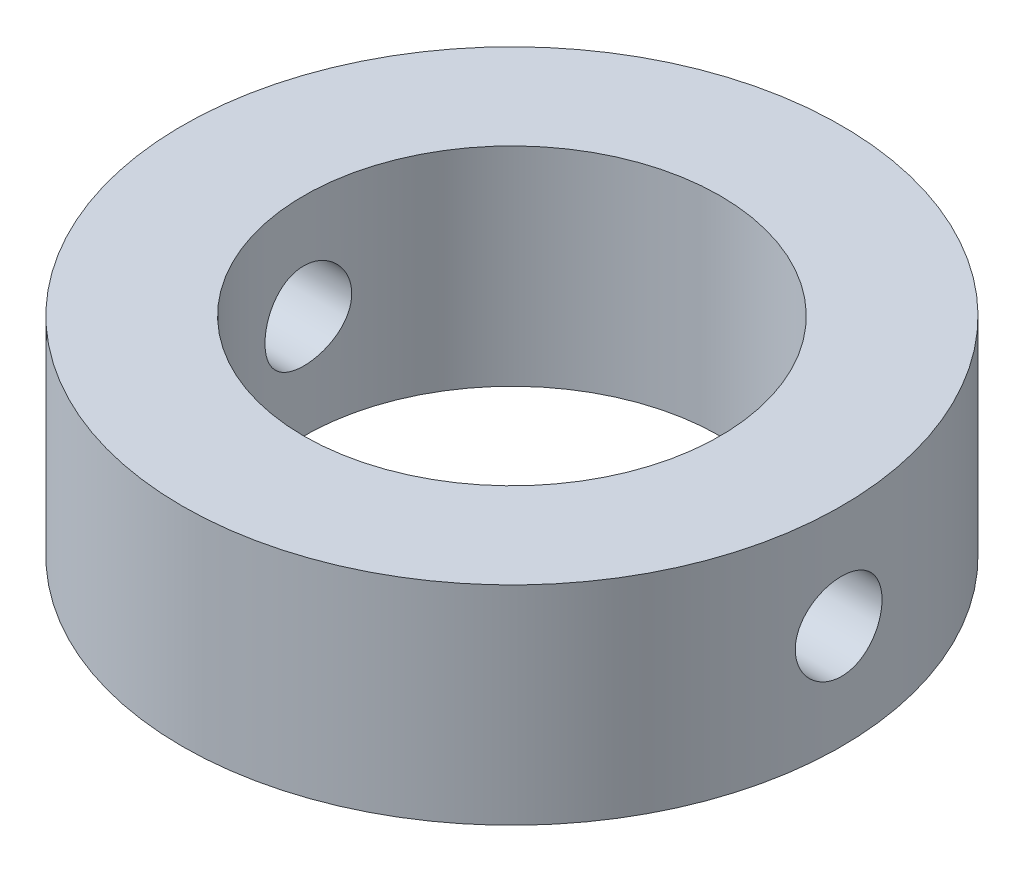
ISO-10303-21;
HEADER;
FILE_DESCRIPTION(('STEP AP214'),'2;1');
FILE_NAME('part.step','',(''),(''),'','','');
FILE_SCHEMA(('AUTOMOTIVE_DESIGN { 1 0 10303 214 1 1 1 1 }'));
ENDSEC;
DATA;
#1=APPLICATION_CONTEXT('core data for automotive mechanical design processes');
#2=APPLICATION_PROTOCOL_DEFINITION('international standard','automotive_design',2000,#1);
#3=PRODUCT_CONTEXT('',#1,'mechanical');
#4=PRODUCT('Part','Part','',(#3));
#5=PRODUCT_RELATED_PRODUCT_CATEGORY('part','',(#4));
#6=PRODUCT_DEFINITION_FORMATION('','',#4);
#7=PRODUCT_DEFINITION_CONTEXT('part definition',#1,'design');
#8=PRODUCT_DEFINITION('design','',#6,#7);
#9=PRODUCT_DEFINITION_SHAPE('','',#8);
#10=(LENGTH_UNIT() NAMED_UNIT(*) SI_UNIT(.MILLI.,.METRE.));
#11=(NAMED_UNIT(*) PLANE_ANGLE_UNIT() SI_UNIT($,.RADIAN.));
#12=(NAMED_UNIT(*) SI_UNIT($,.STERADIAN.) SOLID_ANGLE_UNIT());
#13=UNCERTAINTY_MEASURE_WITH_UNIT(LENGTH_MEASURE(1.E-05),#10,'distance_accuracy_value','');
#14=(GEOMETRIC_REPRESENTATION_CONTEXT(3) GLOBAL_UNCERTAINTY_ASSIGNED_CONTEXT((#13)) GLOBAL_UNIT_ASSIGNED_CONTEXT((#10,
#11,#12)) REPRESENTATION_CONTEXT('',''));
#15=CARTESIAN_POINT('',(0.,0.,0.));
#16=DIRECTION('',(0.,0.,1.));
#17=DIRECTION('',(1.,0.,0.));
#18=AXIS2_PLACEMENT_3D('',#15,#16,#17);
#19=CARTESIAN_POINT('',(0.,11.9999999999999,0.));
#20=DIRECTION('',(0.,1.,0.));
#21=DIRECTION('',(0.,0.,1.));
#22=AXIS2_PLACEMENT_3D('',#19,#20,#21);
#23=PLANE('',#22);
#24=CARTESIAN_POINT('',(0.,11.9999999999999,0.));
#25=DIRECTION('',(0.,1.,0.));
#26=DIRECTION('',(0.,0.,1.));
#27=AXIS2_PLACEMENT_3D('',#24,#25,#26);
#28=CIRCLE('',#27,19.);
#29=CARTESIAN_POINT('',(0.,11.9999999999999,19.));
#30=VERTEX_POINT('',#29);
#31=EDGE_CURVE('E12',#30,#30,#28,.T.);
#32=ORIENTED_EDGE('',*,*,#31,.T.);
#33=EDGE_LOOP('',(#32));
#34=FACE_BOUND('',#33,.T.);
#35=CARTESIAN_POINT('',(0.,11.9999999999999,0.));
#36=DIRECTION('',(0.,1.,0.));
#37=DIRECTION('',(0.,0.,1.));
#38=AXIS2_PLACEMENT_3D('',#35,#36,#37);
#39=CIRCLE('',#38,12.);
#40=CARTESIAN_POINT('',(0.,11.9999999999999,12.));
#41=VERTEX_POINT('',#40);
#42=EDGE_CURVE('E72',#41,#41,#39,.T.);
#43=ORIENTED_EDGE('',*,*,#42,.F.);
#44=EDGE_LOOP('',(#43));
#45=FACE_BOUND('',#44,.T.);
#46=ADVANCED_FACE('F50',(#34,#45),#23,.T.);
#47=CARTESIAN_POINT('',(0.,0.,0.));
#48=DIRECTION('',(0.,1.,0.));
#49=DIRECTION('',(0.,0.,1.));
#50=AXIS2_PLACEMENT_3D('',#47,#48,#49);
#51=PLANE('',#50);
#52=CARTESIAN_POINT('',(0.,0.,0.));
#53=DIRECTION('',(0.,1.,0.));
#54=DIRECTION('',(0.,0.,1.));
#55=AXIS2_PLACEMENT_3D('',#52,#53,#54);
#56=CIRCLE('',#55,19.);
#57=CARTESIAN_POINT('',(0.,0.,19.));
#58=VERTEX_POINT('',#57);
#59=EDGE_CURVE('E65',#58,#58,#56,.T.);
#60=ORIENTED_EDGE('',*,*,#59,.F.);
#61=EDGE_LOOP('',(#60));
#62=FACE_BOUND('',#61,.T.);
#63=CARTESIAN_POINT('',(0.,0.,0.));
#64=DIRECTION('',(0.,1.,0.));
#65=DIRECTION('',(0.,0.,1.));
#66=AXIS2_PLACEMENT_3D('',#63,#64,#65);
#67=CIRCLE('',#66,12.);
#68=CARTESIAN_POINT('',(0.,0.,12.));
#69=VERTEX_POINT('',#68);
#70=EDGE_CURVE('E75',#69,#69,#67,.T.);
#71=ORIENTED_EDGE('',*,*,#70,.T.);
#72=EDGE_LOOP('',(#71));
#73=FACE_BOUND('',#72,.T.);
#74=ADVANCED_FACE('F118',(#62,#73),#51,.F.);
#75=CARTESIAN_POINT('',(0.,11.9999999999999,0.));
#76=DIRECTION('',(0.,-1.,0.));
#77=DIRECTION('',(0.,0.,-1.));
#78=AXIS2_PLACEMENT_3D('',#75,#76,#77);
#79=CYLINDRICAL_SURFACE('',#78,19.);
#80=CARTESIAN_POINT('',(-19.,3.50000000000017,0.));
#81=CARTESIAN_POINT('',(-18.999997967774,3.5000058990541,-0.139778315489342));
#82=CARTESIAN_POINT('',(-18.9984412683558,3.51176232524163,-0.279642447495395));
#83=CARTESIAN_POINT('',(-18.9923810422329,3.55847299596374,-0.555474474016736));
#84=CARTESIAN_POINT('',(-18.9878744896332,3.59345106127454,-0.691438217949581));
#85=CARTESIAN_POINT('',(-18.9764219373405,3.68555294093905,-0.955436642925225));
#86=CARTESIAN_POINT('',(-18.9694776299244,3.74266139534077,-1.0834767521693));
#87=CARTESIAN_POINT('',(-18.9539206812216,3.87736834545596,-1.3281327783285));
#88=CARTESIAN_POINT('',(-18.9453083126858,3.9549634920643,-1.44475055826474));
#89=CARTESIAN_POINT('',(-18.9273173646443,4.12894461887619,-1.66398308687906));
#90=CARTESIAN_POINT('',(-18.9179348817317,4.22543026047303,-1.76651843289975));
#91=CARTESIAN_POINT('',(-18.8994924119599,4.43423935267,-1.9539913314688));
#92=CARTESIAN_POINT('',(-18.890432442053,4.54656363425645,-2.03892796010927));
#93=CARTESIAN_POINT('',(-18.8736225658863,4.78438210150586,-2.18909162338545));
#94=CARTESIAN_POINT('',(-18.8658776941046,4.90992404405353,-2.25424363629096));
#95=CARTESIAN_POINT('',(-18.8526269269547,5.17028669033124,-2.362509462566));
#96=CARTESIAN_POINT('',(-18.8471209376663,5.30510700455943,-2.40562420041083));
#97=CARTESIAN_POINT('',(-18.8390089488849,5.57937222882252,-2.46834893112867));
#98=CARTESIAN_POINT('',(-18.8363863510935,5.7187858602936,-2.488093505723));
#99=CARTESIAN_POINT('',(-18.8342874081066,5.99897057854637,-2.50393399543621));
#100=CARTESIAN_POINT('',(-18.8348109231579,6.13974160475402,-2.50003096100303));
#101=CARTESIAN_POINT('',(-18.8389298660036,6.41770409794457,-2.46879737750755));
#102=CARTESIAN_POINT('',(-18.8425058020086,6.55491259793688,-2.44161547626707));
#103=CARTESIAN_POINT('',(-18.852296258763,6.8228037627535,-2.36482786882146));
#104=CARTESIAN_POINT('',(-18.8585108382319,6.95348628227829,-2.3152216635911));
#105=CARTESIAN_POINT('',(-18.8729003199956,7.20507533515605,-2.19483509097748));
#106=CARTESIAN_POINT('',(-18.8810811502029,7.32595079901067,-2.12399053069554));
#107=CARTESIAN_POINT('',(-18.8984768576706,7.55415393130091,-1.96318413435716));
#108=CARTESIAN_POINT('',(-18.9076917872935,7.66148091311375,-1.87322133002779));
#109=CARTESIAN_POINT('',(-18.9262039286229,7.86040295092153,-1.67591027855665));
#110=CARTESIAN_POINT('',(-18.9355012293485,7.9518710348813,-1.56843398279009));
#111=CARTESIAN_POINT('',(-18.9530645440151,8.11548884034062,-1.33958658891131));
#112=CARTESIAN_POINT('',(-18.9613305551191,8.18763850869801,-1.21821545257769));
#113=CARTESIAN_POINT('',(-18.9759058695861,8.31057308687675,-0.964922757293793));
#114=CARTESIAN_POINT('',(-18.9822144030351,8.36134959301136,-0.832997072631032));
#115=CARTESIAN_POINT('',(-18.9921571388022,8.43999334343779,-0.562390331231878));
#116=CARTESIAN_POINT('',(-18.9957914799384,8.46786177690386,-0.423709625549321));
#117=CARTESIAN_POINT('',(-18.9999582136113,8.49973268466778,-0.144626841595007));
#118=CARTESIAN_POINT('',(-19.0005133278906,8.50390998199248,-0.0042450539789587));
#119=CARTESIAN_POINT('',(-18.9985205333266,8.48874205734641,0.275216665266651));
#120=CARTESIAN_POINT('',(-18.9959726978817,8.46939739177325,0.414296627611674));
#121=CARTESIAN_POINT('',(-18.9880744020358,8.4078799409678,0.686687509150033));
#122=CARTESIAN_POINT('',(-18.9827342327916,8.36579096106234,0.820017679004546));
#123=CARTESIAN_POINT('',(-18.9698488481686,8.26006706877678,1.0777276906161));
#124=CARTESIAN_POINT('',(-18.9623035506347,8.19643135362998,1.20210719868896));
#125=CARTESIAN_POINT('',(-18.9457917882835,8.04900056518352,1.43916303555315));
#126=CARTESIAN_POINT('',(-18.9368174879557,7.96509294211371,1.55176881159969));
#127=CARTESIAN_POINT('',(-18.9184749473973,7.77965876593373,1.76136182953444));
#128=CARTESIAN_POINT('',(-18.9091066897838,7.67813143474603,1.8583483813207));
#129=CARTESIAN_POINT('',(-18.8909615049602,7.45956767417587,2.03457405133132));
#130=CARTESIAN_POINT('',(-18.882188695812,7.3424371490131,2.11369695379337));
#131=CARTESIAN_POINT('',(-18.8662967388838,7.09644632354998,2.25114524350553));
#132=CARTESIAN_POINT('',(-18.8591775549807,6.96758627956332,2.30947108507656));
#133=CARTESIAN_POINT('',(-18.8474274353122,6.70216224479831,2.40348340588751));
#134=CARTESIAN_POINT('',(-18.8427894223098,6.5656214071415,2.43923433050317));
#135=CARTESIAN_POINT('',(-18.8365068588229,6.28840915443809,2.48728896692718));
#136=CARTESIAN_POINT('',(-18.834862152745,6.14773795447582,2.49959389747034));
#137=CARTESIAN_POINT('',(-18.8347572836292,5.86741478209673,2.5003832571314));
#138=CARTESIAN_POINT('',(-18.8362727080524,5.72776329805704,2.48905029281038));
#139=CARTESIAN_POINT('',(-18.8422647251658,5.4523689854998,2.44327339157397));
#140=CARTESIAN_POINT('',(-18.8467413170668,5.31662615594053,2.40882946081803));
#141=CARTESIAN_POINT('',(-18.8581434764999,5.05293301890442,2.31786734754341));
#142=CARTESIAN_POINT('',(-18.8650679582855,4.92497928606827,2.26135895042263));
#143=CARTESIAN_POINT('',(-18.8805873470397,4.68034027576126,2.12788991460025));
#144=CARTESIAN_POINT('',(-18.8891822838294,4.56365519951513,2.05092891076786));
#145=CARTESIAN_POINT('',(-18.9071536004537,4.34393356557024,1.87806508524074));
#146=CARTESIAN_POINT('',(-18.916535291463,4.24100437672455,1.78202633147284));
#147=CARTESIAN_POINT('',(-18.9349767535594,4.05265455625561,1.57401834864));
#148=CARTESIAN_POINT('',(-18.9440364485309,3.9672380419353,1.46204538383399));
#149=CARTESIAN_POINT('',(-18.9608556769231,3.81602776093198,1.22480279057951));
#150=CARTESIAN_POINT('',(-18.9686095798624,3.75031806417573,1.09947920166897));
#151=CARTESIAN_POINT('',(-18.9818871351467,3.64097269894889,0.839540973043685));
#152=CARTESIAN_POINT('',(-18.9874131818538,3.59731331933187,0.704936491101737));
#153=CARTESIAN_POINT('',(-18.9942975150946,3.54362547377539,0.474714442967861));
#154=CARTESIAN_POINT('',(-18.9964253917168,3.52728979302763,0.380541684686516));
#155=CARTESIAN_POINT('',(-18.9992773223142,3.50547508744208,0.190925958585074));
#156=CARTESIAN_POINT('',(-19.0000013882199,3.4999959703381,0.0954830015668991));
#157=CARTESIAN_POINT('',(-19.,3.50000000000017,0.));
#158=B_SPLINE_CURVE_WITH_KNOTS('',3,(#80,#81,#82,#83,#84,#85,#86,#87,#88,#89,#90,#91,#92,#93,
#94,#95,#96,#97,#98,#99,#100,#101,#102,#103,#104,#105,#106,#107,#108,#109,#110,#111,#112,#113,
#114,#115,#116,#117,#118,#119,#120,#121,#122,#123,#124,#125,#126,#127,#128,#129,#130,#131,#132,
#133,#134,#135,#136,#137,#138,#139,#140,#141,#142,#143,#144,#145,#146,#147,#148,#149,#150,#151,
#152,#153,#154,#155,#156,#157),.UNSPECIFIED.,.T.,.F.,(4,2,2,2,2,2,2,2,2,2,2,2,2,2,2,2,2,2,2,2,2,
2,2,2,2,2,2,2,2,2,2,2,2,2,2,2,2,2,4),(0.,0.418986144750723,0.838402751295027,1.25752877489169,
1.67658632335897,2.09791737096995,2.51927053226657,2.9422020352143,3.36511579450623,
3.78558208482054,4.20602969778296,4.62381238038419,5.04160436068177,5.46067207111284,
5.87976101093419,6.30206422391832,6.72436859858552,7.1468388638243,7.56928719694783,
7.98861407741509,8.40793103915519,8.82571338706289,9.24351130200046,9.66368440831753,
10.0838760739928,10.5067272952288,10.9295692785286,11.3511986374783,11.7728060793192,
12.1911686022118,12.6095310136043,13.0277080952791,13.4458926429743,13.8671712161902,
14.2885487204712,14.7116990687393,15.1343934209874,15.4206065905888,15.7068173277526),.UNSPECIFIED.);
#159=CARTESIAN_POINT('',(-19.,3.50000000000017,0.));
#160=VERTEX_POINT('',#159);
#161=EDGE_CURVE('E102',#160,#160,#158,.T.);
#162=ORIENTED_EDGE('',*,*,#161,.T.);
#163=EDGE_LOOP('',(#162));
#164=FACE_BOUND('',#163,.T.);
#165=CARTESIAN_POINT('',(18.8348082018373,6.00000000000001,-2.49999999999997));
#166=CARTESIAN_POINT('',(18.8348103005536,5.86022758929279,-2.49999409578521));
#167=CARTESIAN_POINT('',(18.8363808783556,5.72036934508234,-2.48823862932081));
#168=CARTESIAN_POINT('',(18.8424906592257,5.44454955039561,-2.44153211686145));
#169=CARTESIAN_POINT('',(18.847032913542,5.30859215515884,-2.40655722916084));
#170=CARTESIAN_POINT('',(18.8585628581225,5.0446071597013,-2.31446464350117));
#171=CARTESIAN_POINT('',(18.865548835081,4.91657407753232,-2.25736245608316));
#172=CARTESIAN_POINT('',(18.8811770275024,4.67192984440484,-2.12267026806165));
#173=CARTESIAN_POINT('',(18.8898189733877,4.55531683901755,-2.04508360138151));
#174=CARTESIAN_POINT('',(18.9078452303946,4.33607899603067,-1.87111107289514));
#175=CARTESIAN_POINT('',(18.9172333815059,4.23353505523291,-1.77462365227275));
#176=CARTESIAN_POINT('',(18.9356597775486,4.04604554653708,-1.56580738299603));
#177=CARTESIAN_POINT('',(18.9446980046157,3.96110087615615,-1.45347772691952));
#178=CARTESIAN_POINT('',(18.9614457365024,3.8109287424548,-1.21565447428567));
#179=CARTESIAN_POINT('',(18.9691502393821,3.74577484071776,-1.09011404546432));
#180=CARTESIAN_POINT('',(18.9823201413144,3.63750510589477,-0.829754686720052));
#181=CARTESIAN_POINT('',(18.9877856320778,3.59438837013915,-0.694936137097178));
#182=CARTESIAN_POINT('',(18.9958346390645,3.53165955479605,-0.420676626941264));
#183=CARTESIAN_POINT('',(18.998434675905,3.51191268823255,-0.281266987599388));
#184=CARTESIAN_POINT('',(19.0005162894914,3.4960662310645,-0.00109010892106713));
#185=CARTESIAN_POINT('',(18.9999980014017,3.49996561550747,0.139677071308378));
#186=CARTESIAN_POINT('',(18.9959146873144,3.53119335852877,0.417655495625253));
#187=CARTESIAN_POINT('',(18.9923685140246,3.55837674580221,0.554883341583901));
#188=CARTESIAN_POINT('',(18.9826489891626,3.63517400713243,0.822812428692207));
#189=CARTESIAN_POINT('',(18.9764755831414,3.68478834606977,0.953513534513099));
#190=CARTESIAN_POINT('',(18.9621627474723,3.80519188547965,1.20512535683876));
#191=CARTESIAN_POINT('',(18.9540175457263,3.87604340196792,1.32600591164241));
#192=CARTESIAN_POINT('',(18.9366715492132,4.03686471257975,1.55421628813348));
#193=CARTESIAN_POINT('',(18.9274707008428,4.12683547773427,1.66154542112794));
#194=CARTESIAN_POINT('',(18.9089599960682,4.32415225368483,1.8604586981773));
#195=CARTESIAN_POINT('',(18.8996498417821,4.43162466849589,1.95191747053698));
#196=CARTESIAN_POINT('',(18.8820383954161,4.66046095236194,2.11551832656893));
#197=CARTESIAN_POINT('',(18.8737371071471,4.78182487388462,2.18766033727909));
#198=CARTESIAN_POINT('',(18.8590834811492,5.03511545410108,2.31058937477482));
#199=CARTESIAN_POINT('',(18.8527321240045,5.16704738533947,2.36136566187573));
#200=CARTESIAN_POINT('',(18.8427161416511,5.43766772815002,2.44000706743173));
#201=CARTESIAN_POINT('',(18.8390513724318,5.57635577714573,2.46787341394898));
#202=CARTESIAN_POINT('',(18.8348501026747,5.85544222939526,2.49973643317736));
#203=CARTESIAN_POINT('',(18.8342904384187,5.99582011732506,2.50390985775512));
#204=CARTESIAN_POINT('',(18.8363014282045,6.27527311289575,2.48873557934188));
#205=CARTESIAN_POINT('',(18.8388720081163,6.41434825130956,2.46938843336159));
#206=CARTESIAN_POINT('',(18.8468326765771,6.68671384532071,2.40787130174427));
#207=CARTESIAN_POINT('',(18.8522121143747,6.82002410692966,2.36578750914771));
#208=CARTESIAN_POINT('',(18.8651757043717,7.07769659074719,2.26008064221155));
#209=CARTESIAN_POINT('',(18.8727599418992,7.20205846641082,2.19645673422975));
#210=CARTESIAN_POINT('',(18.8893338461434,7.43910187947641,2.04904355294261));
#211=CARTESIAN_POINT('',(18.8983314583415,7.5517109977698,1.96513873634297));
#212=CARTESIAN_POINT('',(18.9166936217277,7.7613120622572,1.77970815022908));
#213=CARTESIAN_POINT('',(18.926058188752,7.85830333352441,1.67818161958447));
#214=CARTESIAN_POINT('',(18.9441705799359,8.03453978862296,1.45961588711246));
#215=CARTESIAN_POINT('',(18.9529141182398,8.11366858191621,1.34248242957229));
#216=CARTESIAN_POINT('',(18.9687346092958,8.25112719879764,1.09648411237262));
#217=CARTESIAN_POINT('',(18.9758115987047,8.30945747987751,0.967619510833947));
#218=CARTESIAN_POINT('',(18.9874826488638,8.40347261332042,0.702197878857117));
#219=CARTESIAN_POINT('',(18.9920839805179,8.43922383380961,0.565664689717663));
#220=CARTESIAN_POINT('',(18.9983155475114,8.48728165155051,0.288468615416651));
#221=CARTESIAN_POINT('',(18.9999459320545,8.49958942615505,0.147805938002317));
#222=CARTESIAN_POINT('',(19.0000510083828,8.50038732371441,-0.132521661638358));
#223=CARTESIAN_POINT('',(18.9985494326838,8.48905656815036,-0.272186098802342));
#224=CARTESIAN_POINT('',(18.9926066364397,8.44327953837205,-0.54760688256613));
#225=CARTESIAN_POINT('',(18.9881654195457,8.40883329286811,-0.683363234019707));
#226=CARTESIAN_POINT('',(18.9768400549043,8.31786118504367,-0.947084347123984));
#227=CARTESIAN_POINT('',(18.969956962381,8.26134485895372,-1.07505244642359));
#228=CARTESIAN_POINT('',(18.9545084892845,8.12785549941434,-1.31971689824453));
#229=CARTESIAN_POINT('',(18.94594308002,8.05088211707002,-1.43641305847677));
#230=CARTESIAN_POINT('',(18.9280077185042,7.87800438938253,-1.65613473301187));
#231=CARTESIAN_POINT('',(18.9186323881523,7.78196696135386,-1.75905510552542));
#232=CARTESIAN_POINT('',(18.9001761775766,7.57396529634811,-1.94738775545751));
#233=CARTESIAN_POINT('',(18.8910953674186,7.46199730315992,-2.03279589210141));
#234=CARTESIAN_POINT('',(18.8742148988462,7.2247590416737,-2.18399681776488));
#235=CARTESIAN_POINT('',(18.8664208881083,7.09943390887039,-2.24970411848513));
#236=CARTESIAN_POINT('',(18.8530626099899,6.83949246795944,-2.35904458082509));
#237=CARTESIAN_POINT('',(18.8474959460153,6.70488632996713,-2.40270148171339));
#238=CARTESIAN_POINT('',(18.8405583157814,6.47467086224897,-2.4563825831966));
#239=CARTESIAN_POINT('',(18.8384129295943,6.38050681294457,-2.47271523019388));
#240=CARTESIAN_POINT('',(18.8355371620448,6.19090851784086,-2.49452590747468));
#241=CARTESIAN_POINT('',(18.834806768268,6.09547428319282,-2.50000403298953));
#242=CARTESIAN_POINT('',(18.8348082018373,6.00000000000001,-2.49999999999997));
#243=B_SPLINE_CURVE_WITH_KNOTS('',3,(#165,#166,#167,#168,#169,#170,#171,#172,#173,#174,#175,
#176,#177,#178,#179,#180,#181,#182,#183,#184,#185,#186,#187,#188,#189,#190,#191,#192,#193,#194,
#195,#196,#197,#198,#199,#200,#201,#202,#203,#204,#205,#206,#207,#208,#209,#210,#211,#212,#213,
#214,#215,#216,#217,#218,#219,#220,#221,#222,#223,#224,#225,#226,#227,#228,#229,#230,#231,#232,
#233,#234,#235,#236,#237,#238,#239,#240,#241,#242),.UNSPECIFIED.,.T.,.F.,(4,2,2,2,2,2,2,2,2,2,2,
2,2,2,2,2,2,2,2,2,2,2,2,2,2,2,2,2,2,2,2,2,2,2,2,2,2,2,4),(0.,0.418968405157197,
0.838367673884138,1.25747348717207,1.67651113147077,2.09786539850384,2.5192411482253,
2.94216449298385,3.36507051288859,3.78552532472123,4.20596191196845,4.62379964025597,
5.04164602861028,5.46073070560068,5.87983667220908,6.3021160344823,6.72439699174138,
7.14688995971325,7.56936027893765,7.9886747382032,8.4079792675183,8.82570528325025,
9.24344746759809,9.66362813695484,10.0838269595901,10.5066894380017,10.9295426144014,
11.351147013838,11.7727302393305,12.1911305153045,12.6095302716104,13.0277494418252,
13.4459757452216,13.8672313515222,14.2885864492938,14.711744327081,15.1344456605117,
15.4206327478507,15.7068173243378),.UNSPECIFIED.);
#244=CARTESIAN_POINT('',(18.8348082018373,6.00000000000001,-2.49999999999997));
#245=VERTEX_POINT('',#244);
#246=EDGE_CURVE('E96',#245,#245,#243,.T.);
#247=ORIENTED_EDGE('',*,*,#246,.T.);
#248=EDGE_LOOP('',(#247));
#249=FACE_BOUND('',#248,.T.);
#250=ORIENTED_EDGE('',*,*,#31,.F.);
#251=EDGE_LOOP('',(#250));
#252=FACE_BOUND('',#251,.T.);
#253=ORIENTED_EDGE('',*,*,#59,.T.);
#254=EDGE_LOOP('',(#253));
#255=FACE_BOUND('',#254,.T.);
#256=ADVANCED_FACE('F52',(#164,#249,#252,#255),#79,.T.);
#257=CARTESIAN_POINT('',(0.,11.9999999999999,0.));
#258=DIRECTION('',(0.,-1.,0.));
#259=DIRECTION('',(0.,0.,-1.));
#260=AXIS2_PLACEMENT_3D('',#257,#258,#259);
#261=CYLINDRICAL_SURFACE('',#260,12.);
#262=CARTESIAN_POINT('',(-11.7366945943055,6.00000000000012,-2.49999999999995));
#263=CARTESIAN_POINT('',(-11.7366973843002,6.13878123030388,-2.49999501755294));
#264=CARTESIAN_POINT('',(-11.7391829184982,6.27762394403099,-2.48840458867919));
#265=CARTESIAN_POINT('',(-11.7488403116287,6.55137263463411,-2.44239298467528));
#266=CARTESIAN_POINT('',(-11.7560157627658,6.68627551101278,-2.40795430880673));
#267=CARTESIAN_POINT('',(-11.7742058592406,6.94814474566991,-2.31736795014464));
#268=CARTESIAN_POINT('',(-11.7852165141395,7.0751191919837,-2.26124282497865));
#269=CARTESIAN_POINT('',(-11.8098316267143,7.31784899929125,-2.12893977203462));
#270=CARTESIAN_POINT('',(-11.8234359795523,7.4336048134601,-2.05276265471637));
#271=CARTESIAN_POINT('',(-11.8519386932295,7.65239075030702,-1.88127279893215));
#272=CARTESIAN_POINT('',(-11.8668522874608,7.75522378725304,-1.78571110973933));
#273=CARTESIAN_POINT('',(-11.8961593360515,7.9435221372963,-1.57870244776125));
#274=CARTESIAN_POINT('',(-11.9105527521983,8.02898617658295,-1.46725431091197));
#275=CARTESIAN_POINT('',(-11.937362702377,8.1808917761658,-1.23032410599914));
#276=CARTESIAN_POINT('',(-11.9497591726249,8.24714505292664,-1.10471885640987));
#277=CARTESIAN_POINT('',(-11.9710069468661,8.35753210571965,-0.843857102013427));
#278=CARTESIAN_POINT('',(-11.9798586112245,8.4016681303071,-0.708601579901156));
#279=CARTESIAN_POINT('',(-11.9929117978436,8.465951522235,-0.434325808400969));
#280=CARTESIAN_POINT('',(-11.9971778391985,8.48643203439046,-0.295386761832685));
#281=CARTESIAN_POINT('',(-12.0008022516123,8.50386339151415,-0.0159836976790198));
#282=CARTESIAN_POINT('',(-12.0001611340738,8.50081668838624,0.12448015947371));
#283=CARTESIAN_POINT('',(-11.9940931618102,8.47153079808654,0.400653172399196));
#284=CARTESIAN_POINT('',(-11.9887403791317,8.44565056208386,0.536402257453019));
#285=CARTESIAN_POINT('',(-11.9739344179777,8.37200274933751,0.80158749257958));
#286=CARTESIAN_POINT('',(-11.9644810658381,8.32423424559393,0.93102337502211));
#287=CARTESIAN_POINT('',(-11.9424153464785,8.20783989574907,1.18092001076944));
#288=CARTESIAN_POINT('',(-11.9297820825069,8.13907541158078,1.30131426996338));
#289=CARTESIAN_POINT('',(-11.9027460088038,7.98274399431926,1.52898691302136));
#290=CARTESIAN_POINT('',(-11.8883429791665,7.8951747235878,1.63626366363288));
#291=CARTESIAN_POINT('',(-11.8590340046655,7.70175675021794,1.83678840655387));
#292=CARTESIAN_POINT('',(-11.8441236995185,7.59559388003618,1.92973297498967));
#293=CARTESIAN_POINT('',(-11.8157374529799,7.36903590201047,2.09655194480983));
#294=CARTESIAN_POINT('',(-11.8022615435432,7.24864047722557,2.17042592139963));
#295=CARTESIAN_POINT('',(-11.7782599681831,6.99657549034243,2.29712434276911));
#296=CARTESIAN_POINT('',(-11.7677417046425,6.86487869861317,2.34989610979461));
#297=CARTESIAN_POINT('',(-11.7509521282072,6.59421676126127,2.43247155077352));
#298=CARTESIAN_POINT('',(-11.7446802101437,6.45525265438385,2.462278497647));
#299=CARTESIAN_POINT('',(-11.7372156647827,6.17676058736222,2.49761727734036));
#300=CARTESIAN_POINT('',(-11.7359310372695,6.03729083092598,2.50358885836));
#301=CARTESIAN_POINT('',(-11.7383390403741,5.75934837691976,2.49227386878593));
#302=CARTESIAN_POINT('',(-11.7420313630525,5.62087561819538,2.47498873715729));
#303=CARTESIAN_POINT('',(-11.7538907645233,5.35035896788382,2.41803116650971));
#304=CARTESIAN_POINT('',(-11.76201022566,5.21826266564243,2.37859682753746));
#305=CARTESIAN_POINT('',(-11.7817667700624,4.9625520211169,2.27871621721841));
#306=CARTESIAN_POINT('',(-11.7934041638211,4.83893842869932,2.21826809112295));
#307=CARTESIAN_POINT('',(-11.8190900387438,4.60178711756766,2.0770919636297));
#308=CARTESIAN_POINT('',(-11.8331701329665,4.48841559106777,1.99609065470793));
#309=CARTESIAN_POINT('',(-11.8620696798782,4.27671350168993,1.81646888113978));
#310=CARTESIAN_POINT('',(-11.8768892153307,4.17838462752155,1.71784644101038));
#311=CARTESIAN_POINT('',(-11.9058984863348,3.9978745738057,1.50380090168672));
#312=CARTESIAN_POINT('',(-11.9200734943982,3.91599180994732,1.38812381522912));
#313=CARTESIAN_POINT('',(-11.9459341754482,3.77282249582416,1.14440020443274));
#314=CARTESIAN_POINT('',(-11.9576199584164,3.71153503552519,1.01635422695381));
#315=CARTESIAN_POINT('',(-11.9771229654136,3.61172264136541,0.752284235695893));
#316=CARTESIAN_POINT('',(-11.9849632627299,3.57306166891146,0.616313421940432));
#317=CARTESIAN_POINT('',(-11.9959912282046,3.5191711919839,0.339626801006981));
#318=CARTESIAN_POINT('',(-11.9991795068579,3.50393861293454,0.198911618923434));
#319=CARTESIAN_POINT('',(-12.0005281611387,3.49746475590296,-0.080426686940608));
#320=CARTESIAN_POINT('',(-11.9987822750957,3.50577620001058,-0.219039184355754));
#321=CARTESIAN_POINT('',(-11.99065748189,3.54516127730604,-0.492845740747064));
#322=CARTESIAN_POINT('',(-11.9842786434588,3.5762345728138,-0.628039850405434));
#323=CARTESIAN_POINT('',(-11.9676092015489,3.66005558929708,-0.890863930983973));
#324=CARTESIAN_POINT('',(-11.9573290681437,3.71274532770578,-1.01851310000869));
#325=CARTESIAN_POINT('',(-11.9339599069615,3.83824479546467,-1.26322113444177));
#326=CARTESIAN_POINT('',(-11.9208706346327,3.91105627668841,-1.38027907656018));
#327=CARTESIAN_POINT('',(-11.8930319356995,4.07621933598458,-1.60268064259532));
#328=CARTESIAN_POINT('',(-11.8782576059507,4.16888857610561,-1.70778526722735));
#329=CARTESIAN_POINT('',(-11.8488557363333,4.37048900200219,-1.9011054839652));
#330=CARTESIAN_POINT('',(-11.8342282323044,4.47942405992648,-1.98931704315914));
#331=CARTESIAN_POINT('',(-11.8065838324643,4.71201820484113,-2.14734903704121));
#332=CARTESIAN_POINT('',(-11.7935881325424,4.83583682282073,-2.21693856248131));
#333=CARTESIAN_POINT('',(-11.7709407916825,5.09365031206224,-2.33421255844765));
#334=CARTESIAN_POINT('',(-11.7612862067076,5.22763609687857,-2.38191632583498));
#335=CARTESIAN_POINT('',(-11.7482800883641,5.46821256315328,-2.44513108264676));
#336=CARTESIAN_POINT('',(-11.7439632719021,5.57345907319061,-2.46566898011596));
#337=CARTESIAN_POINT('',(-11.7381695052653,5.78579156103771,-2.49310508716545));
#338=CARTESIAN_POINT('',(-11.7366924407628,5.89287746461888,-2.50000384585399));
#339=CARTESIAN_POINT('',(-11.7366945943055,6.00000000000012,-2.49999999999995));
#340=B_SPLINE_CURVE_WITH_KNOTS('',3,(#262,#263,#264,#265,#266,#267,#268,#269,#270,#271,#272,
#273,#274,#275,#276,#277,#278,#279,#280,#281,#282,#283,#284,#285,#286,#287,#288,#289,#290,#291,
#292,#293,#294,#295,#296,#297,#298,#299,#300,#301,#302,#303,#304,#305,#306,#307,#308,#309,#310,
#311,#312,#313,#314,#315,#316,#317,#318,#319,#320,#321,#322,#323,#324,#325,#326,#327,#328,#329,
#330,#331,#332,#333,#334,#335,#336,#337,#338,#339),.UNSPECIFIED.,.T.,.F.,(4,2,2,2,2,2,2,2,2,2,2,
2,2,2,2,2,2,2,2,2,2,2,2,2,2,2,2,2,2,2,2,2,2,2,2,2,2,2,4),(0.,0.415951308142506,
0.832221584834871,1.2480600296054,1.66388166963154,2.08542666935766,2.50700257327745,
2.93258052533684,3.35811520213862,3.77758097718526,4.19700303792676,4.60994682832922,
5.02290810911742,5.43865743955899,5.8544584820852,6.27811724489829,6.70178544383259,
7.12650474664978,7.55116350775197,7.96795032019586,8.38471134593049,8.79707572463842,
9.20947650928055,9.62767835869301,10.0459271216437,10.4711891750669,10.8964324351808,
11.3190919929706,11.7416960791916,12.1563258784528,12.5709495266596,12.984468211702,
13.3980229105635,13.8187663795715,14.2396101685507,14.6654530271771,15.0909196914727,
15.4119973517483,15.7330620852562),.UNSPECIFIED.);
#341=CARTESIAN_POINT('',(-11.7366945943055,6.00000000000012,-2.49999999999995));
#342=VERTEX_POINT('',#341);
#343=EDGE_CURVE('E55',#342,#342,#340,.T.);
#344=ORIENTED_EDGE('',*,*,#343,.F.);
#345=EDGE_LOOP('',(#344));
#346=FACE_BOUND('',#345,.T.);
#347=CARTESIAN_POINT('',(11.7366945943055,5.99999999999995,-2.49999999999996));
#348=CARTESIAN_POINT('',(11.7366973843002,5.86121876969619,-2.49999501755294));
#349=CARTESIAN_POINT('',(11.7391829184982,5.72237605596908,-2.48840458867916));
#350=CARTESIAN_POINT('',(11.7488403116286,5.44862736536596,-2.44239298467527));
#351=CARTESIAN_POINT('',(11.7560157627658,5.31372448898728,-2.40795430880676));
#352=CARTESIAN_POINT('',(11.7742058592405,5.05185525433018,-2.31736795014467));
#353=CARTESIAN_POINT('',(11.7852165141394,4.92488080801642,-2.26124282497863));
#354=CARTESIAN_POINT('',(11.8098316267143,4.68215100070892,-2.12893977203457));
#355=CARTESIAN_POINT('',(11.8234359795523,4.56639518654007,-2.05276265471634));
#356=CARTESIAN_POINT('',(11.8519386932295,4.34760924969317,-1.88127279893212));
#357=CARTESIAN_POINT('',(11.8668522874608,4.24477621274716,-1.78571110973928));
#358=CARTESIAN_POINT('',(11.8961593360515,4.05647786270388,-1.57870244776122));
#359=CARTESIAN_POINT('',(11.9105527521983,3.97101382341719,-1.46725431091196));
#360=CARTESIAN_POINT('',(11.937362702377,3.81910822383436,-1.23032410599912));
#361=CARTESIAN_POINT('',(11.9497591726248,3.75285494707359,-1.10471885640981));
#362=CARTESIAN_POINT('',(11.971006946866,3.64246789428053,-0.843857102013366));
#363=CARTESIAN_POINT('',(11.9798586112244,3.59833186969298,-0.708601579901124));
#364=CARTESIAN_POINT('',(11.9929117978436,3.53404847776511,-0.43432580840096));
#365=CARTESIAN_POINT('',(11.9971778391985,3.51356796560977,-0.295386761832672));
#366=CARTESIAN_POINT('',(12.0008022516122,3.49613660848609,-0.0159836976790149));
#367=CARTESIAN_POINT('',(12.0001611340738,3.4991833116139,0.124480159473702));
#368=CARTESIAN_POINT('',(11.9940931618102,3.52846920191359,0.40065317239916));
#369=CARTESIAN_POINT('',(11.9887403791317,3.55434943791636,0.536402257452968));
#370=CARTESIAN_POINT('',(11.9739344179777,3.62799725066272,0.801587492579535));
#371=CARTESIAN_POINT('',(11.964481065838,3.67576575440624,0.931023375022086));
#372=CARTESIAN_POINT('',(11.9424153464784,3.79216010425108,1.18092001076941));
#373=CARTESIAN_POINT('',(11.9297820825069,3.86092458841943,1.30131426996332));
#374=CARTESIAN_POINT('',(11.9027460088038,4.01725600568094,1.52898691302132));
#375=CARTESIAN_POINT('',(11.8883429791665,4.10482527641234,1.63626366363288));
#376=CARTESIAN_POINT('',(11.8590340046655,4.29824324978218,1.83678840655386));
#377=CARTESIAN_POINT('',(11.8441236995185,4.40440611996398,1.9297329749896));
#378=CARTESIAN_POINT('',(11.8157374529799,4.63096409798969,2.09655194480976));
#379=CARTESIAN_POINT('',(11.8022615435432,4.75135952277454,2.17042592139961));
#380=CARTESIAN_POINT('',(11.7782599681831,5.00342450965765,2.2971243427691));
#381=CARTESIAN_POINT('',(11.7677417046425,5.13512130138691,2.34989610979455));
#382=CARTESIAN_POINT('',(11.7509521282072,5.40578323873879,2.43247155077346));
#383=CARTESIAN_POINT('',(11.7446802101436,5.54474734561619,2.46227849764699));
#384=CARTESIAN_POINT('',(11.7372156647826,5.82323941263781,2.49761727734038));
#385=CARTESIAN_POINT('',(11.7359310372695,5.96270916907406,2.50358885836));
#386=CARTESIAN_POINT('',(11.7383390403741,6.24065162308029,2.49227386878592));
#387=CARTESIAN_POINT('',(11.7420313630524,6.37912438180468,2.47498873715728));
#388=CARTESIAN_POINT('',(11.7538907645233,6.64964103211629,2.41803116650971));
#389=CARTESIAN_POINT('',(11.7620102256599,6.78173733435773,2.37859682753748));
#390=CARTESIAN_POINT('',(11.7817667700624,7.0374479788833,2.27871621721842));
#391=CARTESIAN_POINT('',(11.7934041638211,7.1610615713009,2.21826809112294));
#392=CARTESIAN_POINT('',(11.8190900387438,7.39821288243256,2.07709196362971));
#393=CARTESIAN_POINT('',(11.8331701329664,7.51158440893245,1.99609065470798));
#394=CARTESIAN_POINT('',(11.8620696798781,7.72328649831019,1.81646888113981));
#395=CARTESIAN_POINT('',(11.8768892153306,7.82161537247848,1.71784644101036));
#396=CARTESIAN_POINT('',(11.9058984863347,8.00212542619435,1.5038009016867));
#397=CARTESIAN_POINT('',(11.9200734943982,8.08400819005285,1.38812381522916));
#398=CARTESIAN_POINT('',(11.9459341754481,8.22717750417608,1.14440020443278));
#399=CARTESIAN_POINT('',(11.9576199584163,8.28846496447499,1.0163542269538));
#400=CARTESIAN_POINT('',(11.9771229654135,8.38827735863479,0.752284235695862));
#401=CARTESIAN_POINT('',(11.9849632627299,8.42693833108881,0.616313421940424));
#402=CARTESIAN_POINT('',(11.9959912282046,8.4808288080163,0.339626801006977));
#403=CARTESIAN_POINT('',(11.9991795068579,8.49606138706552,0.198911618923409));
#404=CARTESIAN_POINT('',(12.0005281611386,8.5025352440971,-0.0804266869406619));
#405=CARTESIAN_POINT('',(11.9987822750957,8.49422379998962,-0.219039184355817));
#406=CARTESIAN_POINT('',(11.99065748189,8.45483872269421,-0.492845740747114));
#407=CARTESIAN_POINT('',(11.9842786434588,8.42376542718637,-0.628039850405462));
#408=CARTESIAN_POINT('',(11.9676092015489,8.33994441070308,-0.890863930983994));
#409=CARTESIAN_POINT('',(11.9573290681437,8.28725467229445,-1.01851310000872));
#410=CARTESIAN_POINT('',(11.9339599069615,8.16175520453556,-1.26322113444177));
#411=CARTESIAN_POINT('',(11.9208706346327,8.08894372331174,-1.38027907656012));
#412=CARTESIAN_POINT('',(11.8930319356994,7.92378066401556,-1.60268064259528));
#413=CARTESIAN_POINT('',(11.8782576059507,7.83111142389459,-1.70778526722738));
#414=CARTESIAN_POINT('',(11.8488557363333,7.62951099799801,-1.90110548396524));
#415=CARTESIAN_POINT('',(11.8342282323044,7.52057594007366,-1.98931704315912));
#416=CARTESIAN_POINT('',(11.8065838324643,7.28798179515899,-2.14734903704119));
#417=CARTESIAN_POINT('',(11.7935881325424,7.16416317717943,-2.21693856248136));
#418=CARTESIAN_POINT('',(11.7709407916825,6.90634968793792,-2.33421255844769));
#419=CARTESIAN_POINT('',(11.7612862067076,6.77236390312155,-2.38191632583494));
#420=CARTESIAN_POINT('',(11.748280088364,6.53178743684683,-2.44513108264672));
#421=CARTESIAN_POINT('',(11.7439632719021,6.4265409268095,-2.46566898011597));
#422=CARTESIAN_POINT('',(11.7381695052652,6.21420843896238,-2.4931050871655));
#423=CARTESIAN_POINT('',(11.7366924407628,6.1071225353812,-2.50000384585402));
#424=CARTESIAN_POINT('',(11.7366945943055,5.99999999999995,-2.49999999999996));
#425=B_SPLINE_CURVE_WITH_KNOTS('',3,(#347,#348,#349,#350,#351,#352,#353,#354,#355,#356,#357,
#358,#359,#360,#361,#362,#363,#364,#365,#366,#367,#368,#369,#370,#371,#372,#373,#374,#375,#376,
#377,#378,#379,#380,#381,#382,#383,#384,#385,#386,#387,#388,#389,#390,#391,#392,#393,#394,#395,
#396,#397,#398,#399,#400,#401,#402,#403,#404,#405,#406,#407,#408,#409,#410,#411,#412,#413,#414,
#415,#416,#417,#418,#419,#420,#421,#422,#423,#424),.UNSPECIFIED.,.T.,.F.,(4,2,2,2,2,2,2,2,2,2,2,
2,2,2,2,2,2,2,2,2,2,2,2,2,2,2,2,2,2,2,2,2,2,2,2,2,2,2,4),(0.,0.415951308142503,
0.832221584834862,1.24806002960535,1.66388166963144,2.08542666935757,2.50700257327736,
2.93258052533677,3.35811520213855,3.77758097718515,4.19700303792662,4.60994682832907,
5.02290810911727,5.43865743955884,5.85445848208505,6.2781172448981,6.70178544383238,
7.12650474664954,7.55116350775169,7.9679503201956,8.38471134593026,8.79707572463828,
9.20947650928049,9.62767835869285,10.0459271216435,10.4711891750667,10.8964324351806,
11.3190919929705,11.7416960791915,12.1563258784528,12.5709495266595,12.9844682117019,
13.3980229105633,13.8187663795713,14.2396101685506,14.665453027177,15.0909196914726,
15.4119973517482,15.7330620852561),.UNSPECIFIED.);
#426=CARTESIAN_POINT('',(11.7366945943055,5.99999999999995,-2.49999999999996));
#427=VERTEX_POINT('',#426);
#428=EDGE_CURVE('E77',#427,#427,#425,.T.);
#429=ORIENTED_EDGE('',*,*,#428,.F.);
#430=EDGE_LOOP('',(#429));
#431=FACE_BOUND('',#430,.T.);
#432=ORIENTED_EDGE('',*,*,#42,.T.);
#433=EDGE_LOOP('',(#432));
#434=FACE_BOUND('',#433,.T.);
#435=ORIENTED_EDGE('',*,*,#70,.F.);
#436=EDGE_LOOP('',(#435));
#437=FACE_BOUND('',#436,.T.);
#438=ADVANCED_FACE('F83',(#346,#431,#434,#437),#261,.F.);
#439=CARTESIAN_POINT('',(-19.,6.00000000000012,0.));
#440=DIRECTION('',(1.,0.,0.));
#441=DIRECTION('',(0.,0.,-1.));
#442=AXIS2_PLACEMENT_3D('',#439,#440,#441);
#443=CYLINDRICAL_SURFACE('',#442,2.5);
#444=ORIENTED_EDGE('',*,*,#428,.T.);
#445=EDGE_LOOP('',(#444));
#446=FACE_BOUND('',#445,.T.);
#447=ORIENTED_EDGE('',*,*,#246,.F.);
#448=EDGE_LOOP('',(#447));
#449=FACE_BOUND('',#448,.T.);
#450=ADVANCED_FACE('F89',(#446,#449),#443,.F.);
#451=ORIENTED_EDGE('',*,*,#343,.T.);
#452=EDGE_LOOP('',(#451));
#453=FACE_BOUND('',#452,.T.);
#454=ORIENTED_EDGE('',*,*,#161,.F.);
#455=EDGE_LOOP('',(#454));
#456=FACE_BOUND('',#455,.T.);
#457=ADVANCED_FACE('F86',(#453,#456),#443,.F.);
#458=CLOSED_SHELL('',(#46,#74,#256,#438,#450,#457));
#459=MANIFOLD_SOLID_BREP('B2',#458);
#460=ADVANCED_BREP_SHAPE_REPRESENTATION('',(#18,#459),#14);
#461=SHAPE_DEFINITION_REPRESENTATION(#9,#460);
ENDSEC;
END-ISO-10303-21;
